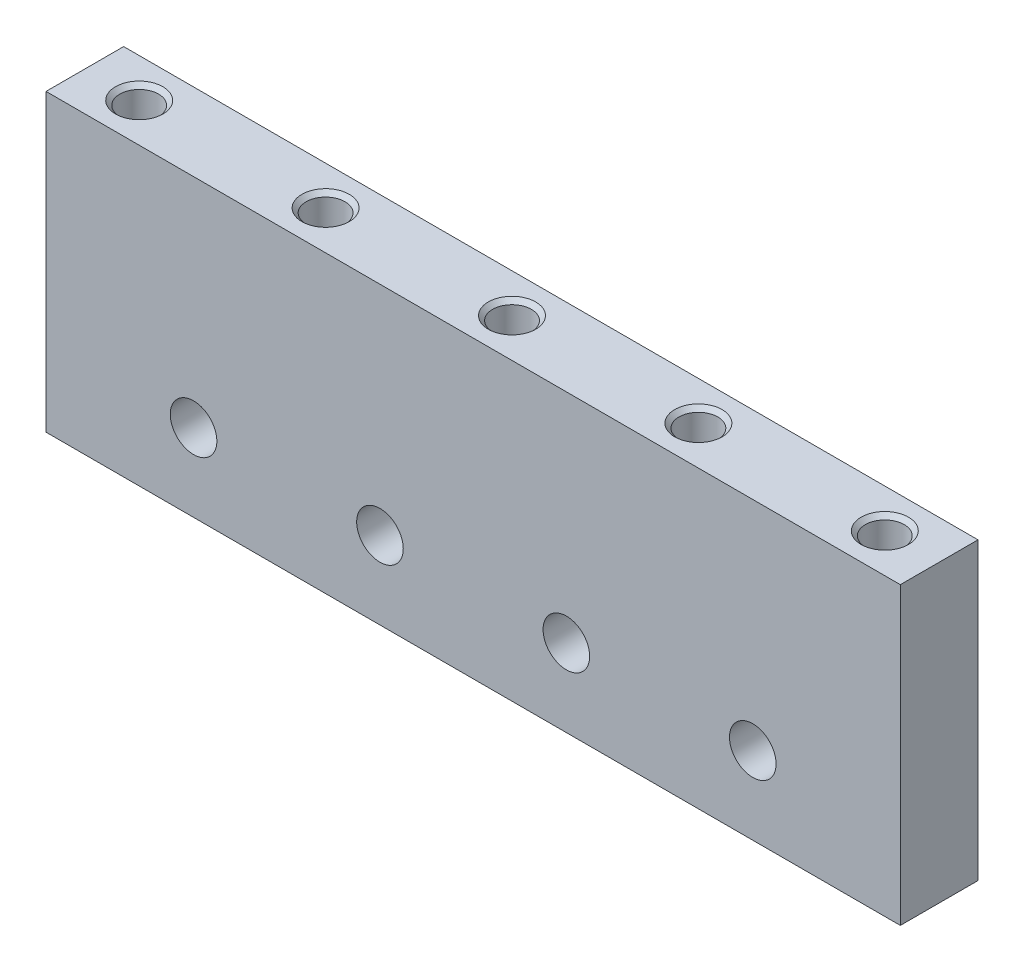
ISO-10303-21;
HEADER;
FILE_DESCRIPTION(('STEP AP214'),'2;1');
FILE_NAME('part.step','',(''),(''),'','','');
FILE_SCHEMA(('AUTOMOTIVE_DESIGN { 1 0 10303 214 1 1 1 1 }'));
ENDSEC;
DATA;
#1=APPLICATION_CONTEXT('core data for automotive mechanical design processes');
#2=APPLICATION_PROTOCOL_DEFINITION('international standard','automotive_design',2000,#1);
#3=PRODUCT_CONTEXT('',#1,'mechanical');
#4=PRODUCT('Part','Part','',(#3));
#5=PRODUCT_RELATED_PRODUCT_CATEGORY('part','',(#4));
#6=PRODUCT_DEFINITION_FORMATION('','',#4);
#7=PRODUCT_DEFINITION_CONTEXT('part definition',#1,'design');
#8=PRODUCT_DEFINITION('design','',#6,#7);
#9=PRODUCT_DEFINITION_SHAPE('','',#8);
#10=(LENGTH_UNIT() NAMED_UNIT(*) SI_UNIT(.MILLI.,.METRE.));
#11=(NAMED_UNIT(*) PLANE_ANGLE_UNIT() SI_UNIT($,.RADIAN.));
#12=(NAMED_UNIT(*) SI_UNIT($,.STERADIAN.) SOLID_ANGLE_UNIT());
#13=UNCERTAINTY_MEASURE_WITH_UNIT(LENGTH_MEASURE(1.E-05),#10,'distance_accuracy_value','');
#14=(GEOMETRIC_REPRESENTATION_CONTEXT(3) GLOBAL_UNCERTAINTY_ASSIGNED_CONTEXT((#13)) GLOBAL_UNIT_ASSIGNED_CONTEXT((#10,
#11,#12)) REPRESENTATION_CONTEXT('',''));
#15=CARTESIAN_POINT('',(0.,0.,0.));
#16=DIRECTION('',(0.,0.,1.));
#17=DIRECTION('',(1.,0.,0.));
#18=AXIS2_PLACEMENT_3D('',#15,#16,#17);
#19=CARTESIAN_POINT('',(0.,0.,5.));
#20=DIRECTION('',(0.,0.,1.));
#21=DIRECTION('',(1.,0.,0.));
#22=AXIS2_PLACEMENT_3D('',#19,#20,#21);
#23=PLANE('',#22);
#24=CARTESIAN_POINT('',(-6.,-4.50000000000016,5.));
#25=DIRECTION('',(0.,0.,1.));
#26=DIRECTION('',(1.,0.,0.));
#27=AXIS2_PLACEMENT_3D('',#24,#25,#26);
#28=CIRCLE('',#27,1.5);
#29=CARTESIAN_POINT('',(-4.5,-4.50000000000016,5.));
#30=VERTEX_POINT('',#29);
#31=EDGE_CURVE('E161',#30,#30,#28,.T.);
#32=ORIENTED_EDGE('',*,*,#31,.F.);
#33=EDGE_LOOP('',(#32));
#34=FACE_BOUND('',#33,.T.);
#35=CARTESIAN_POINT('',(18.,-4.49999999999999,5.));
#36=DIRECTION('',(0.,0.,1.));
#37=DIRECTION('',(1.,0.,0.));
#38=AXIS2_PLACEMENT_3D('',#35,#36,#37);
#39=CIRCLE('',#38,1.5);
#40=CARTESIAN_POINT('',(19.5,-4.49999999999999,5.));
#41=VERTEX_POINT('',#40);
#42=EDGE_CURVE('E173',#41,#41,#39,.T.);
#43=ORIENTED_EDGE('',*,*,#42,.F.);
#44=EDGE_LOOP('',(#43));
#45=FACE_BOUND('',#44,.T.);
#46=DIRECTION('',(0.,1.,0.));
#47=VECTOR('',#46,1.);
#48=CARTESIAN_POINT('',(27.5,9.49999999999999,5.));
#49=LINE('',#48,#47);
#50=CARTESIAN_POINT('',(27.5,-9.50000000000001,5.));
#51=VERTEX_POINT('',#50);
#52=CARTESIAN_POINT('',(27.5,9.49999999999999,5.));
#53=VERTEX_POINT('',#52);
#54=EDGE_CURVE('E179',#51,#53,#49,.T.);
#55=ORIENTED_EDGE('',*,*,#54,.T.);
#56=DIRECTION('',(-1.,0.,0.));
#57=VECTOR('',#56,1.);
#58=CARTESIAN_POINT('',(-27.5,9.50000000000001,5.));
#59=LINE('',#58,#57);
#60=CARTESIAN_POINT('',(-27.5,9.50000000000001,5.));
#61=VERTEX_POINT('',#60);
#62=EDGE_CURVE('E85',#53,#61,#59,.T.);
#63=ORIENTED_EDGE('',*,*,#62,.T.);
#64=DIRECTION('',(0.,-1.,0.));
#65=VECTOR('',#64,1.);
#66=CARTESIAN_POINT('',(-27.5,9.50000000000001,5.));
#67=LINE('',#66,#65);
#68=CARTESIAN_POINT('',(-27.5,-9.50000000000001,5.));
#69=VERTEX_POINT('',#68);
#70=EDGE_CURVE('E182',#61,#69,#67,.T.);
#71=ORIENTED_EDGE('',*,*,#70,.T.);
#72=DIRECTION('',(1.,0.,0.));
#73=VECTOR('',#72,1.);
#74=CARTESIAN_POINT('',(-27.5,-9.50000000000001,5.));
#75=LINE('',#74,#73);
#76=EDGE_CURVE('E54',#69,#51,#75,.T.);
#77=ORIENTED_EDGE('',*,*,#76,.T.);
#78=EDGE_LOOP('',(#55,#63,#71,#77));
#79=FACE_BOUND('',#78,.T.);
#80=CARTESIAN_POINT('',(6.,-4.50000000000008,5.));
#81=DIRECTION('',(0.,0.,1.));
#82=DIRECTION('',(1.,0.,0.));
#83=AXIS2_PLACEMENT_3D('',#80,#81,#82);
#84=CIRCLE('',#83,1.5);
#85=CARTESIAN_POINT('',(7.5,-4.50000000000008,5.));
#86=VERTEX_POINT('',#85);
#87=EDGE_CURVE('E167',#86,#86,#84,.T.);
#88=ORIENTED_EDGE('',*,*,#87,.F.);
#89=EDGE_LOOP('',(#88));
#90=FACE_BOUND('',#89,.T.);
#91=CARTESIAN_POINT('',(-18.,-4.50000000000024,5.));
#92=DIRECTION('',(0.,0.,1.));
#93=DIRECTION('',(1.,0.,0.));
#94=AXIS2_PLACEMENT_3D('',#91,#92,#93);
#95=CIRCLE('',#94,1.5);
#96=CARTESIAN_POINT('',(-16.5,-4.50000000000024,5.));
#97=VERTEX_POINT('',#96);
#98=EDGE_CURVE('E155',#97,#97,#95,.T.);
#99=ORIENTED_EDGE('',*,*,#98,.F.);
#100=EDGE_LOOP('',(#99));
#101=FACE_BOUND('',#100,.T.);
#102=ADVANCED_FACE('F37',(#34,#45,#79,#90,#101),#23,.T.);
#103=CARTESIAN_POINT('',(0.,0.,0.));
#104=DIRECTION('',(0.,0.,1.));
#105=DIRECTION('',(1.,0.,0.));
#106=AXIS2_PLACEMENT_3D('',#103,#104,#105);
#107=PLANE('',#106);
#108=DIRECTION('',(0.,1.,0.));
#109=VECTOR('',#108,1.);
#110=CARTESIAN_POINT('',(27.5,9.49999999999999,0.));
#111=LINE('',#110,#109);
#112=CARTESIAN_POINT('',(27.5,-9.50000000000001,0.));
#113=VERTEX_POINT('',#112);
#114=CARTESIAN_POINT('',(27.5,9.49999999999999,0.));
#115=VERTEX_POINT('',#114);
#116=EDGE_CURVE('E176',#113,#115,#111,.T.);
#117=ORIENTED_EDGE('',*,*,#116,.F.);
#118=DIRECTION('',(1.,0.,0.));
#119=VECTOR('',#118,1.);
#120=CARTESIAN_POINT('',(-27.5,-9.50000000000001,0.));
#121=LINE('',#120,#119);
#122=CARTESIAN_POINT('',(-27.5,-9.50000000000001,0.));
#123=VERTEX_POINT('',#122);
#124=EDGE_CURVE('E78',#123,#113,#121,.T.);
#125=ORIENTED_EDGE('',*,*,#124,.F.);
#126=DIRECTION('',(0.,-1.,0.));
#127=VECTOR('',#126,1.);
#128=CARTESIAN_POINT('',(-27.5,9.50000000000001,0.));
#129=LINE('',#128,#127);
#130=CARTESIAN_POINT('',(-27.5,9.50000000000001,0.));
#131=VERTEX_POINT('',#130);
#132=EDGE_CURVE('E72',#131,#123,#129,.T.);
#133=ORIENTED_EDGE('',*,*,#132,.F.);
#134=DIRECTION('',(-1.,0.,0.));
#135=VECTOR('',#134,1.);
#136=CARTESIAN_POINT('',(-27.5,9.50000000000001,0.));
#137=LINE('',#136,#135);
#138=EDGE_CURVE('E188',#115,#131,#137,.T.);
#139=ORIENTED_EDGE('',*,*,#138,.F.);
#140=EDGE_LOOP('',(#117,#125,#133,#139));
#141=FACE_BOUND('',#140,.T.);
#142=CARTESIAN_POINT('',(18.,-4.49999999999999,0.));
#143=DIRECTION('',(0.,0.,1.));
#144=DIRECTION('',(1.,0.,0.));
#145=AXIS2_PLACEMENT_3D('',#142,#143,#144);
#146=CIRCLE('',#145,1.5);
#147=CARTESIAN_POINT('',(19.5,-4.49999999999999,0.));
#148=VERTEX_POINT('',#147);
#149=EDGE_CURVE('E170',#148,#148,#146,.T.);
#150=ORIENTED_EDGE('',*,*,#149,.T.);
#151=EDGE_LOOP('',(#150));
#152=FACE_BOUND('',#151,.T.);
#153=CARTESIAN_POINT('',(6.,-4.50000000000008,0.));
#154=DIRECTION('',(0.,0.,1.));
#155=DIRECTION('',(1.,0.,0.));
#156=AXIS2_PLACEMENT_3D('',#153,#154,#155);
#157=CIRCLE('',#156,1.5);
#158=CARTESIAN_POINT('',(7.5,-4.50000000000008,0.));
#159=VERTEX_POINT('',#158);
#160=EDGE_CURVE('E164',#159,#159,#157,.T.);
#161=ORIENTED_EDGE('',*,*,#160,.T.);
#162=EDGE_LOOP('',(#161));
#163=FACE_BOUND('',#162,.T.);
#164=CARTESIAN_POINT('',(-6.,-4.50000000000016,0.));
#165=DIRECTION('',(0.,0.,1.));
#166=DIRECTION('',(1.,0.,0.));
#167=AXIS2_PLACEMENT_3D('',#164,#165,#166);
#168=CIRCLE('',#167,1.5);
#169=CARTESIAN_POINT('',(-4.5,-4.50000000000016,0.));
#170=VERTEX_POINT('',#169);
#171=EDGE_CURVE('E158',#170,#170,#168,.T.);
#172=ORIENTED_EDGE('',*,*,#171,.T.);
#173=EDGE_LOOP('',(#172));
#174=FACE_BOUND('',#173,.T.);
#175=CARTESIAN_POINT('',(-18.,-4.50000000000024,0.));
#176=DIRECTION('',(0.,0.,1.));
#177=DIRECTION('',(1.,0.,0.));
#178=AXIS2_PLACEMENT_3D('',#175,#176,#177);
#179=CIRCLE('',#178,1.5);
#180=CARTESIAN_POINT('',(-16.5,-4.50000000000024,0.));
#181=VERTEX_POINT('',#180);
#182=EDGE_CURVE('E154',#181,#181,#179,.T.);
#183=ORIENTED_EDGE('',*,*,#182,.T.);
#184=EDGE_LOOP('',(#183));
#185=FACE_BOUND('',#184,.T.);
#186=ADVANCED_FACE('F198',(#141,#152,#163,#174,#185),#107,.F.);
#187=CARTESIAN_POINT('',(27.5,9.49999999999999,5.));
#188=DIRECTION('',(-1.,0.,0.));
#189=DIRECTION('',(0.,-1.,0.));
#190=AXIS2_PLACEMENT_3D('',#187,#188,#189);
#191=PLANE('',#190);
#192=ORIENTED_EDGE('',*,*,#116,.T.);
#193=DIRECTION('',(0.,0.,-1.));
#194=VECTOR('',#193,1.);
#195=CARTESIAN_POINT('',(27.5,9.49999999999999,5.));
#196=LINE('',#195,#194);
#197=EDGE_CURVE('E11',#53,#115,#196,.T.);
#198=ORIENTED_EDGE('',*,*,#197,.F.);
#199=ORIENTED_EDGE('',*,*,#54,.F.);
#200=DIRECTION('',(0.,0.,-1.));
#201=VECTOR('',#200,1.);
#202=CARTESIAN_POINT('',(27.5,-9.50000000000001,5.));
#203=LINE('',#202,#201);
#204=EDGE_CURVE('E185',#51,#113,#203,.T.);
#205=ORIENTED_EDGE('',*,*,#204,.T.);
#206=EDGE_LOOP('',(#192,#198,#199,#205));
#207=FACE_BOUND('',#206,.T.);
#208=ADVANCED_FACE('F39',(#207),#191,.F.);
#209=CARTESIAN_POINT('',(-27.5,9.50000000000001,5.));
#210=DIRECTION('',(0.,-1.,0.));
#211=DIRECTION('',(1.,0.,0.));
#212=AXIS2_PLACEMENT_3D('',#209,#210,#211);
#213=PLANE('',#212);
#214=CARTESIAN_POINT('',(-24.,9.50000000000001,2.50000000000009));
#215=DIRECTION('',(0.,1.,0.));
#216=DIRECTION('',(0.,0.,1.));
#217=AXIS2_PLACEMENT_3D('',#214,#215,#216);
#218=CIRCLE('',#217,1.525);
#219=CARTESIAN_POINT('',(-24.,9.50000000000001,4.02500000000009));
#220=VERTEX_POINT('',#219);
#221=EDGE_CURVE('E118',#220,#220,#218,.T.);
#222=ORIENTED_EDGE('',*,*,#221,.F.);
#223=EDGE_LOOP('',(#222));
#224=FACE_BOUND('',#223,.T.);
#225=CARTESIAN_POINT('',(-12.,9.50000000000001,2.50000000000001));
#226=DIRECTION('',(0.,1.,0.));
#227=DIRECTION('',(0.,0.,1.));
#228=AXIS2_PLACEMENT_3D('',#225,#226,#227);
#229=CIRCLE('',#228,1.525);
#230=CARTESIAN_POINT('',(-12.,9.50000000000001,4.02500000000001));
#231=VERTEX_POINT('',#230);
#232=EDGE_CURVE('E111',#231,#231,#229,.T.);
#233=ORIENTED_EDGE('',*,*,#232,.F.);
#234=EDGE_LOOP('',(#233));
#235=FACE_BOUND('',#234,.T.);
#236=CARTESIAN_POINT('',(0.,9.5,2.5));
#237=DIRECTION('',(0.,1.,0.));
#238=DIRECTION('',(0.,0.,1.));
#239=AXIS2_PLACEMENT_3D('',#236,#237,#238);
#240=CIRCLE('',#239,1.525);
#241=CARTESIAN_POINT('',(0.,9.5,4.025));
#242=VERTEX_POINT('',#241);
#243=EDGE_CURVE('E127',#242,#242,#240,.T.);
#244=ORIENTED_EDGE('',*,*,#243,.F.);
#245=EDGE_LOOP('',(#244));
#246=FACE_BOUND('',#245,.T.);
#247=CARTESIAN_POINT('',(12.,9.5,2.50000000000001));
#248=DIRECTION('',(0.,1.,0.));
#249=DIRECTION('',(0.,0.,1.));
#250=AXIS2_PLACEMENT_3D('',#247,#248,#249);
#251=CIRCLE('',#250,1.525);
#252=CARTESIAN_POINT('',(12.,9.5,4.02500000000001));
#253=VERTEX_POINT('',#252);
#254=EDGE_CURVE('E136',#253,#253,#251,.T.);
#255=ORIENTED_EDGE('',*,*,#254,.F.);
#256=EDGE_LOOP('',(#255));
#257=FACE_BOUND('',#256,.T.);
#258=CARTESIAN_POINT('',(24.,9.49999999999999,2.50000000000001));
#259=DIRECTION('',(0.,1.,0.));
#260=DIRECTION('',(0.,0.,1.));
#261=AXIS2_PLACEMENT_3D('',#258,#259,#260);
#262=CIRCLE('',#261,1.525);
#263=CARTESIAN_POINT('',(24.,9.49999999999999,4.02500000000001));
#264=VERTEX_POINT('',#263);
#265=EDGE_CURVE('E145',#264,#264,#262,.T.);
#266=ORIENTED_EDGE('',*,*,#265,.F.);
#267=EDGE_LOOP('',(#266));
#268=FACE_BOUND('',#267,.T.);
#269=ORIENTED_EDGE('',*,*,#138,.T.);
#270=DIRECTION('',(0.,0.,-1.));
#271=VECTOR('',#270,1.);
#272=CARTESIAN_POINT('',(-27.5,9.50000000000001,5.));
#273=LINE('',#272,#271);
#274=EDGE_CURVE('E46',#61,#131,#273,.T.);
#275=ORIENTED_EDGE('',*,*,#274,.F.);
#276=ORIENTED_EDGE('',*,*,#62,.F.);
#277=ORIENTED_EDGE('',*,*,#197,.T.);
#278=EDGE_LOOP('',(#269,#275,#276,#277));
#279=FACE_BOUND('',#278,.T.);
#280=ADVANCED_FACE('F214',(#224,#235,#246,#257,#268,#279),#213,.F.);
#281=CARTESIAN_POINT('',(-27.5,9.50000000000001,5.));
#282=DIRECTION('',(1.,0.,0.));
#283=DIRECTION('',(0.,1.,0.));
#284=AXIS2_PLACEMENT_3D('',#281,#282,#283);
#285=PLANE('',#284);
#286=ORIENTED_EDGE('',*,*,#132,.T.);
#287=DIRECTION('',(0.,0.,-1.));
#288=VECTOR('',#287,1.);
#289=CARTESIAN_POINT('',(-27.5,-9.50000000000001,5.));
#290=LINE('',#289,#288);
#291=EDGE_CURVE('E193',#69,#123,#290,.T.);
#292=ORIENTED_EDGE('',*,*,#291,.F.);
#293=ORIENTED_EDGE('',*,*,#70,.F.);
#294=ORIENTED_EDGE('',*,*,#274,.T.);
#295=EDGE_LOOP('',(#286,#292,#293,#294));
#296=FACE_BOUND('',#295,.T.);
#297=ADVANCED_FACE('F195',(#296),#285,.F.);
#298=CARTESIAN_POINT('',(-27.5,-9.50000000000001,5.));
#299=DIRECTION('',(0.,1.,0.));
#300=DIRECTION('',(0.,0.,1.));
#301=AXIS2_PLACEMENT_3D('',#298,#299,#300);
#302=PLANE('',#301);
#303=ORIENTED_EDGE('',*,*,#124,.T.);
#304=ORIENTED_EDGE('',*,*,#204,.F.);
#305=ORIENTED_EDGE('',*,*,#76,.F.);
#306=ORIENTED_EDGE('',*,*,#291,.T.);
#307=EDGE_LOOP('',(#303,#304,#305,#306));
#308=FACE_BOUND('',#307,.T.);
#309=ADVANCED_FACE('F203',(#308),#302,.F.);
#310=CARTESIAN_POINT('',(18.,-4.49999999999999,5.));
#311=DIRECTION('',(0.,0.,-1.));
#312=DIRECTION('',(-1.,0.,0.));
#313=AXIS2_PLACEMENT_3D('',#310,#311,#312);
#314=CYLINDRICAL_SURFACE('',#313,1.5);
#315=ORIENTED_EDGE('',*,*,#42,.T.);
#316=EDGE_LOOP('',(#315));
#317=FACE_BOUND('',#316,.T.);
#318=ORIENTED_EDGE('',*,*,#149,.F.);
#319=EDGE_LOOP('',(#318));
#320=FACE_BOUND('',#319,.T.);
#321=ADVANCED_FACE('F205',(#317,#320),#314,.F.);
#322=CARTESIAN_POINT('',(6.,-4.50000000000008,5.));
#323=DIRECTION('',(0.,0.,-1.));
#324=DIRECTION('',(-1.,0.,0.));
#325=AXIS2_PLACEMENT_3D('',#322,#323,#324);
#326=CYLINDRICAL_SURFACE('',#325,1.5);
#327=ORIENTED_EDGE('',*,*,#87,.T.);
#328=EDGE_LOOP('',(#327));
#329=FACE_BOUND('',#328,.T.);
#330=ORIENTED_EDGE('',*,*,#160,.F.);
#331=EDGE_LOOP('',(#330));
#332=FACE_BOUND('',#331,.T.);
#333=ADVANCED_FACE('F211',(#329,#332),#326,.F.);
#334=CARTESIAN_POINT('',(-6.,-4.50000000000016,5.));
#335=DIRECTION('',(0.,0.,-1.));
#336=DIRECTION('',(-1.,0.,0.));
#337=AXIS2_PLACEMENT_3D('',#334,#335,#336);
#338=CYLINDRICAL_SURFACE('',#337,1.5);
#339=ORIENTED_EDGE('',*,*,#31,.T.);
#340=EDGE_LOOP('',(#339));
#341=FACE_BOUND('',#340,.T.);
#342=ORIENTED_EDGE('',*,*,#171,.F.);
#343=EDGE_LOOP('',(#342));
#344=FACE_BOUND('',#343,.T.);
#345=ADVANCED_FACE('F228',(#341,#344),#338,.F.);
#346=CARTESIAN_POINT('',(-18.,-4.50000000000024,5.));
#347=DIRECTION('',(0.,0.,-1.));
#348=DIRECTION('',(-1.,0.,0.));
#349=AXIS2_PLACEMENT_3D('',#346,#347,#348);
#350=CYLINDRICAL_SURFACE('',#349,1.5);
#351=ORIENTED_EDGE('',*,*,#98,.T.);
#352=EDGE_LOOP('',(#351));
#353=FACE_BOUND('',#352,.T.);
#354=ORIENTED_EDGE('',*,*,#182,.F.);
#355=EDGE_LOOP('',(#354));
#356=FACE_BOUND('',#355,.T.);
#357=ADVANCED_FACE('F232',(#353,#356),#350,.F.);
#358=CARTESIAN_POINT('',(24.,-0.500000000000007,2.50000000000001));
#359=DIRECTION('',(0.,1.,0.));
#360=DIRECTION('',(0.,0.,1.));
#361=AXIS2_PLACEMENT_3D('',#358,#359,#360);
#362=CONICAL_SURFACE('',#361,1.25,1.02974425867665);
#363=CARTESIAN_POINT('',(24.,-1.25107577378446,2.50000000000001));
#364=VERTEX_POINT('',#363);
#365=VERTEX_LOOP('',#364);
#366=FACE_BOUND('',#365,.T.);
#367=CARTESIAN_POINT('',(24.,-0.500000000000007,2.50000000000001));
#368=DIRECTION('',(0.,1.,0.));
#369=DIRECTION('',(0.,0.,1.));
#370=AXIS2_PLACEMENT_3D('',#367,#368,#369);
#371=CIRCLE('',#370,1.25);
#372=CARTESIAN_POINT('',(24.,-0.500000000000007,3.75));
#373=VERTEX_POINT('',#372);
#374=EDGE_CURVE('E151',#373,#373,#371,.T.);
#375=ORIENTED_EDGE('',*,*,#374,.T.);
#376=EDGE_LOOP('',(#375));
#377=FACE_BOUND('',#376,.T.);
#378=ADVANCED_FACE('F236',(#366,#377),#362,.F.);
#379=CARTESIAN_POINT('',(24.,9.49999999999999,2.50000000000001));
#380=DIRECTION('',(0.,1.,0.));
#381=DIRECTION('',(0.,0.,1.));
#382=AXIS2_PLACEMENT_3D('',#379,#380,#381);
#383=CYLINDRICAL_SURFACE('',#382,1.24999999999999);
#384=ORIENTED_EDGE('',*,*,#374,.F.);
#385=EDGE_LOOP('',(#384));
#386=FACE_BOUND('',#385,.T.);
#387=CARTESIAN_POINT('',(24.,9.225,2.50000000000001));
#388=DIRECTION('',(0.,1.,0.));
#389=DIRECTION('',(0.,0.,1.));
#390=AXIS2_PLACEMENT_3D('',#387,#388,#389);
#391=CIRCLE('',#390,1.24999999999999);
#392=CARTESIAN_POINT('',(24.,9.225,3.75));
#393=VERTEX_POINT('',#392);
#394=EDGE_CURVE('E148',#393,#393,#391,.T.);
#395=ORIENTED_EDGE('',*,*,#394,.T.);
#396=EDGE_LOOP('',(#395));
#397=FACE_BOUND('',#396,.T.);
#398=ADVANCED_FACE('F240',(#386,#397),#383,.F.);
#399=CARTESIAN_POINT('',(24.,9.49999999999999,2.50000000000001));
#400=DIRECTION('',(0.,1.,0.));
#401=DIRECTION('',(0.,0.,1.));
#402=AXIS2_PLACEMENT_3D('',#399,#400,#401);
#403=CONICAL_SURFACE('',#402,1.525,0.78539816339747);
#404=ORIENTED_EDGE('',*,*,#394,.F.);
#405=EDGE_LOOP('',(#404));
#406=FACE_BOUND('',#405,.T.);
#407=ORIENTED_EDGE('',*,*,#265,.T.);
#408=EDGE_LOOP('',(#407));
#409=FACE_BOUND('',#408,.T.);
#410=ADVANCED_FACE('F244',(#406,#409),#403,.F.);
#411=CARTESIAN_POINT('',(12.,-0.500000000000004,2.50000000000001));
#412=DIRECTION('',(0.,1.,0.));
#413=DIRECTION('',(0.,0.,1.));
#414=AXIS2_PLACEMENT_3D('',#411,#412,#413);
#415=CONICAL_SURFACE('',#414,1.25,1.02974425867665);
#416=CARTESIAN_POINT('',(12.,-1.25107577378446,2.50000000000001));
#417=VERTEX_POINT('',#416);
#418=VERTEX_LOOP('',#417);
#419=FACE_BOUND('',#418,.T.);
#420=CARTESIAN_POINT('',(12.,-0.500000000000004,2.50000000000001));
#421=DIRECTION('',(0.,1.,0.));
#422=DIRECTION('',(0.,0.,1.));
#423=AXIS2_PLACEMENT_3D('',#420,#421,#422);
#424=CIRCLE('',#423,1.25);
#425=CARTESIAN_POINT('',(12.,-0.500000000000004,3.75));
#426=VERTEX_POINT('',#425);
#427=EDGE_CURVE('E142',#426,#426,#424,.T.);
#428=ORIENTED_EDGE('',*,*,#427,.T.);
#429=EDGE_LOOP('',(#428));
#430=FACE_BOUND('',#429,.T.);
#431=ADVANCED_FACE('F248',(#419,#430),#415,.F.);
#432=CARTESIAN_POINT('',(12.,9.5,2.50000000000001));
#433=DIRECTION('',(0.,1.,0.));
#434=DIRECTION('',(0.,0.,1.));
#435=AXIS2_PLACEMENT_3D('',#432,#433,#434);
#436=CYLINDRICAL_SURFACE('',#435,1.24999999999999);
#437=ORIENTED_EDGE('',*,*,#427,.F.);
#438=EDGE_LOOP('',(#437));
#439=FACE_BOUND('',#438,.T.);
#440=CARTESIAN_POINT('',(12.,9.225,2.50000000000001));
#441=DIRECTION('',(0.,1.,0.));
#442=DIRECTION('',(0.,0.,1.));
#443=AXIS2_PLACEMENT_3D('',#440,#441,#442);
#444=CIRCLE('',#443,1.24999999999999);
#445=CARTESIAN_POINT('',(12.,9.225,3.75));
#446=VERTEX_POINT('',#445);
#447=EDGE_CURVE('E139',#446,#446,#444,.T.);
#448=ORIENTED_EDGE('',*,*,#447,.T.);
#449=EDGE_LOOP('',(#448));
#450=FACE_BOUND('',#449,.T.);
#451=ADVANCED_FACE('F252',(#439,#450),#436,.F.);
#452=CARTESIAN_POINT('',(12.,9.5,2.50000000000001));
#453=DIRECTION('',(0.,1.,0.));
#454=DIRECTION('',(0.,0.,1.));
#455=AXIS2_PLACEMENT_3D('',#452,#453,#454);
#456=CONICAL_SURFACE('',#455,1.525,0.78539816339747);
#457=ORIENTED_EDGE('',*,*,#447,.F.);
#458=EDGE_LOOP('',(#457));
#459=FACE_BOUND('',#458,.T.);
#460=ORIENTED_EDGE('',*,*,#254,.T.);
#461=EDGE_LOOP('',(#460));
#462=FACE_BOUND('',#461,.T.);
#463=ADVANCED_FACE('F256',(#459,#462),#456,.F.);
#464=CARTESIAN_POINT('',(0.,-0.5,2.5));
#465=DIRECTION('',(0.,1.,0.));
#466=DIRECTION('',(0.,0.,1.));
#467=AXIS2_PLACEMENT_3D('',#464,#465,#466);
#468=CONICAL_SURFACE('',#467,1.25,1.02974425867665);
#469=CARTESIAN_POINT('',(0.,-1.25107577378445,2.5));
#470=VERTEX_POINT('',#469);
#471=VERTEX_LOOP('',#470);
#472=FACE_BOUND('',#471,.T.);
#473=CARTESIAN_POINT('',(0.,-0.5,2.5));
#474=DIRECTION('',(0.,1.,0.));
#475=DIRECTION('',(0.,0.,1.));
#476=AXIS2_PLACEMENT_3D('',#473,#474,#475);
#477=CIRCLE('',#476,1.25);
#478=CARTESIAN_POINT('',(0.,-0.5,3.75));
#479=VERTEX_POINT('',#478);
#480=EDGE_CURVE('E133',#479,#479,#477,.T.);
#481=ORIENTED_EDGE('',*,*,#480,.T.);
#482=EDGE_LOOP('',(#481));
#483=FACE_BOUND('',#482,.T.);
#484=ADVANCED_FACE('F260',(#472,#483),#468,.F.);
#485=CARTESIAN_POINT('',(0.,9.5,2.5));
#486=DIRECTION('',(0.,1.,0.));
#487=DIRECTION('',(0.,0.,1.));
#488=AXIS2_PLACEMENT_3D('',#485,#486,#487);
#489=CYLINDRICAL_SURFACE('',#488,1.24999999999999);
#490=ORIENTED_EDGE('',*,*,#480,.F.);
#491=EDGE_LOOP('',(#490));
#492=FACE_BOUND('',#491,.T.);
#493=CARTESIAN_POINT('',(0.,9.225,2.5));
#494=DIRECTION('',(0.,1.,0.));
#495=DIRECTION('',(0.,0.,1.));
#496=AXIS2_PLACEMENT_3D('',#493,#494,#495);
#497=CIRCLE('',#496,1.24999999999999);
#498=CARTESIAN_POINT('',(0.,9.225,3.74999999999999));
#499=VERTEX_POINT('',#498);
#500=EDGE_CURVE('E130',#499,#499,#497,.T.);
#501=ORIENTED_EDGE('',*,*,#500,.T.);
#502=EDGE_LOOP('',(#501));
#503=FACE_BOUND('',#502,.T.);
#504=ADVANCED_FACE('F264',(#492,#503),#489,.F.);
#505=CARTESIAN_POINT('',(0.,9.5,2.5));
#506=DIRECTION('',(0.,1.,0.));
#507=DIRECTION('',(0.,0.,1.));
#508=AXIS2_PLACEMENT_3D('',#505,#506,#507);
#509=CONICAL_SURFACE('',#508,1.525,0.78539816339747);
#510=ORIENTED_EDGE('',*,*,#500,.F.);
#511=EDGE_LOOP('',(#510));
#512=FACE_BOUND('',#511,.T.);
#513=ORIENTED_EDGE('',*,*,#243,.T.);
#514=EDGE_LOOP('',(#513));
#515=FACE_BOUND('',#514,.T.);
#516=ADVANCED_FACE('F268',(#512,#515),#509,.F.);
#517=CARTESIAN_POINT('',(-12.,-0.499999999999997,2.50000000000001));
#518=DIRECTION('',(0.,1.,0.));
#519=DIRECTION('',(0.,0.,1.));
#520=AXIS2_PLACEMENT_3D('',#517,#518,#519);
#521=CONICAL_SURFACE('',#520,1.25,1.02974425867665);
#522=CARTESIAN_POINT('',(-12.,-1.25107577378445,2.50000000000001));
#523=VERTEX_POINT('',#522);
#524=VERTEX_LOOP('',#523);
#525=FACE_BOUND('',#524,.T.);
#526=CARTESIAN_POINT('',(-12.,-0.499999999999997,2.50000000000001));
#527=DIRECTION('',(0.,1.,0.));
#528=DIRECTION('',(0.,0.,1.));
#529=AXIS2_PLACEMENT_3D('',#526,#527,#528);
#530=CIRCLE('',#529,1.25);
#531=CARTESIAN_POINT('',(-12.,-0.499999999999997,3.75));
#532=VERTEX_POINT('',#531);
#533=EDGE_CURVE('E124',#532,#532,#530,.T.);
#534=ORIENTED_EDGE('',*,*,#533,.T.);
#535=EDGE_LOOP('',(#534));
#536=FACE_BOUND('',#535,.T.);
#537=ADVANCED_FACE('F272',(#525,#536),#521,.F.);
#538=CARTESIAN_POINT('',(-12.,9.5,2.50000000000001));
#539=DIRECTION('',(0.,1.,0.));
#540=DIRECTION('',(0.,0.,1.));
#541=AXIS2_PLACEMENT_3D('',#538,#539,#540);
#542=CYLINDRICAL_SURFACE('',#541,1.24999999999999);
#543=ORIENTED_EDGE('',*,*,#533,.F.);
#544=EDGE_LOOP('',(#543));
#545=FACE_BOUND('',#544,.T.);
#546=CARTESIAN_POINT('',(-12.,9.225,2.50000000000001));
#547=DIRECTION('',(0.,1.,0.));
#548=DIRECTION('',(0.,0.,1.));
#549=AXIS2_PLACEMENT_3D('',#546,#547,#548);
#550=CIRCLE('',#549,1.24999999999999);
#551=CARTESIAN_POINT('',(-12.,9.225,3.75));
#552=VERTEX_POINT('',#551);
#553=EDGE_CURVE('E115',#552,#552,#550,.T.);
#554=ORIENTED_EDGE('',*,*,#553,.T.);
#555=EDGE_LOOP('',(#554));
#556=FACE_BOUND('',#555,.T.);
#557=ADVANCED_FACE('F276',(#545,#556),#542,.F.);
#558=CARTESIAN_POINT('',(-12.,9.50000000000001,2.50000000000001));
#559=DIRECTION('',(0.,1.,0.));
#560=DIRECTION('',(0.,0.,1.));
#561=AXIS2_PLACEMENT_3D('',#558,#559,#560);
#562=CONICAL_SURFACE('',#561,1.525,0.78539816339747);
#563=ORIENTED_EDGE('',*,*,#553,.F.);
#564=EDGE_LOOP('',(#563));
#565=FACE_BOUND('',#564,.T.);
#566=ORIENTED_EDGE('',*,*,#232,.T.);
#567=EDGE_LOOP('',(#566));
#568=FACE_BOUND('',#567,.T.);
#569=ADVANCED_FACE('F105',(#565,#568),#562,.F.);
#570=CARTESIAN_POINT('',(-24.,-0.499999999999994,2.50000000000009));
#571=DIRECTION('',(0.,1.,0.));
#572=DIRECTION('',(0.,0.,1.));
#573=AXIS2_PLACEMENT_3D('',#570,#571,#572);
#574=CONICAL_SURFACE('',#573,1.25,1.02974425867665);
#575=CARTESIAN_POINT('',(-24.,-1.25107577378445,2.50000000000009));
#576=VERTEX_POINT('',#575);
#577=VERTEX_LOOP('',#576);
#578=FACE_BOUND('',#577,.T.);
#579=CARTESIAN_POINT('',(-24.,-0.499999999999994,2.50000000000009));
#580=DIRECTION('',(0.,1.,0.));
#581=DIRECTION('',(0.,0.,1.));
#582=AXIS2_PLACEMENT_3D('',#579,#580,#581);
#583=CIRCLE('',#582,1.25);
#584=CARTESIAN_POINT('',(-24.,-0.499999999999994,3.75000000000009));
#585=VERTEX_POINT('',#584);
#586=EDGE_CURVE('E109',#585,#585,#583,.T.);
#587=ORIENTED_EDGE('',*,*,#586,.T.);
#588=EDGE_LOOP('',(#587));
#589=FACE_BOUND('',#588,.T.);
#590=ADVANCED_FACE('F101',(#578,#589),#574,.F.);
#591=CARTESIAN_POINT('',(-24.,9.50000000000001,2.50000000000009));
#592=DIRECTION('',(0.,1.,0.));
#593=DIRECTION('',(0.,0.,1.));
#594=AXIS2_PLACEMENT_3D('',#591,#592,#593);
#595=CYLINDRICAL_SURFACE('',#594,1.24999999999999);
#596=ORIENTED_EDGE('',*,*,#586,.F.);
#597=EDGE_LOOP('',(#596));
#598=FACE_BOUND('',#597,.T.);
#599=CARTESIAN_POINT('',(-24.,9.22500000000001,2.50000000000009));
#600=DIRECTION('',(0.,1.,0.));
#601=DIRECTION('',(0.,0.,1.));
#602=AXIS2_PLACEMENT_3D('',#599,#600,#601);
#603=CIRCLE('',#602,1.24999999999999);
#604=CARTESIAN_POINT('',(-24.,9.22500000000001,3.75000000000008));
#605=VERTEX_POINT('',#604);
#606=EDGE_CURVE('E112',#605,#605,#603,.T.);
#607=ORIENTED_EDGE('',*,*,#606,.T.);
#608=EDGE_LOOP('',(#607));
#609=FACE_BOUND('',#608,.T.);
#610=ADVANCED_FACE('F104',(#598,#609),#595,.F.);
#611=CARTESIAN_POINT('',(-24.,9.50000000000001,2.50000000000009));
#612=DIRECTION('',(0.,1.,0.));
#613=DIRECTION('',(0.,0.,1.));
#614=AXIS2_PLACEMENT_3D('',#611,#612,#613);
#615=CONICAL_SURFACE('',#614,1.525,0.78539816339747);
#616=ORIENTED_EDGE('',*,*,#606,.F.);
#617=EDGE_LOOP('',(#616));
#618=FACE_BOUND('',#617,.T.);
#619=ORIENTED_EDGE('',*,*,#221,.T.);
#620=EDGE_LOOP('',(#619));
#621=FACE_BOUND('',#620,.T.);
#622=ADVANCED_FACE('F286',(#618,#621),#615,.F.);
#623=CLOSED_SHELL('',(#102,#186,#208,#280,#297,#309,#321,#333,#345,#357,#378,#398,#410,#431,
#451,#463,#484,#504,#516,#537,#557,#569,#590,#610,#622));
#624=MANIFOLD_SOLID_BREP('B2',#623);
#625=ADVANCED_BREP_SHAPE_REPRESENTATION('',(#18,#624),#14);
#626=SHAPE_DEFINITION_REPRESENTATION(#9,#625);
ENDSEC;
END-ISO-10303-21;
